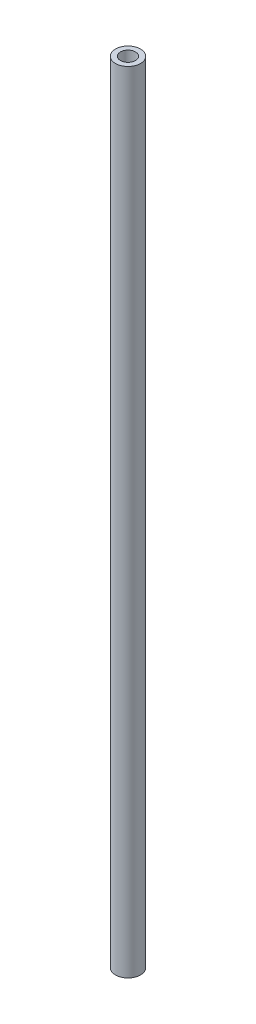
ISO-10303-21;
HEADER;
FILE_DESCRIPTION(('STEP AP214'),'2;1');
FILE_NAME('part.step','',(''),(''),'','','');
FILE_SCHEMA(('AUTOMOTIVE_DESIGN { 1 0 10303 214 1 1 1 1 }'));
ENDSEC;
DATA;
#1=APPLICATION_CONTEXT('core data for automotive mechanical design processes');
#2=APPLICATION_PROTOCOL_DEFINITION('international standard','automotive_design',2000,#1);
#3=PRODUCT_CONTEXT('',#1,'mechanical');
#4=PRODUCT('Part','Part','',(#3));
#5=PRODUCT_RELATED_PRODUCT_CATEGORY('part','',(#4));
#6=PRODUCT_DEFINITION_FORMATION('','',#4);
#7=PRODUCT_DEFINITION_CONTEXT('part definition',#1,'design');
#8=PRODUCT_DEFINITION('design','',#6,#7);
#9=PRODUCT_DEFINITION_SHAPE('','',#8);
#10=(LENGTH_UNIT() NAMED_UNIT(*) SI_UNIT(.MILLI.,.METRE.));
#11=(NAMED_UNIT(*) PLANE_ANGLE_UNIT() SI_UNIT($,.RADIAN.));
#12=(NAMED_UNIT(*) SI_UNIT($,.STERADIAN.) SOLID_ANGLE_UNIT());
#13=UNCERTAINTY_MEASURE_WITH_UNIT(LENGTH_MEASURE(1.E-05),#10,'distance_accuracy_value','');
#14=(GEOMETRIC_REPRESENTATION_CONTEXT(3) GLOBAL_UNCERTAINTY_ASSIGNED_CONTEXT((#13)) GLOBAL_UNIT_ASSIGNED_CONTEXT((#10,
#11,#12)) REPRESENTATION_CONTEXT('',''));
#15=CARTESIAN_POINT('',(0.,0.,0.));
#16=DIRECTION('',(0.,0.,1.));
#17=DIRECTION('',(1.,0.,0.));
#18=AXIS2_PLACEMENT_3D('',#15,#16,#17);
#19=CARTESIAN_POINT('',(0.,50.,0.));
#20=DIRECTION('',(0.,1.,0.));
#21=DIRECTION('',(0.,0.,1.));
#22=AXIS2_PLACEMENT_3D('',#19,#20,#21);
#23=PLANE('',#22);
#24=CARTESIAN_POINT('',(0.,50.,0.));
#25=DIRECTION('',(0.,1.,0.));
#26=DIRECTION('',(0.,0.,1.));
#27=AXIS2_PLACEMENT_3D('',#24,#25,#26);
#28=CIRCLE('',#27,1.5875);
#29=CARTESIAN_POINT('',(0.,50.,1.5875));
#30=VERTEX_POINT('',#29);
#31=EDGE_CURVE('E10',#30,#30,#28,.T.);
#32=ORIENTED_EDGE('',*,*,#31,.T.);
#33=EDGE_LOOP('',(#32));
#34=FACE_BOUND('',#33,.T.);
#35=CARTESIAN_POINT('',(0.,50.,0.));
#36=DIRECTION('',(0.,1.,0.));
#37=DIRECTION('',(0.,0.,1.));
#38=AXIS2_PLACEMENT_3D('',#35,#36,#37);
#39=CIRCLE('',#38,0.9525);
#40=CARTESIAN_POINT('',(0.,50.,0.9525));
#41=VERTEX_POINT('',#40);
#42=EDGE_CURVE('E42',#41,#41,#39,.T.);
#43=ORIENTED_EDGE('',*,*,#42,.F.);
#44=EDGE_LOOP('',(#43));
#45=FACE_BOUND('',#44,.T.);
#46=ADVANCED_FACE('F31',(#34,#45),#23,.T.);
#47=CARTESIAN_POINT('',(0.,-50.,0.));
#48=DIRECTION('',(0.,1.,0.));
#49=DIRECTION('',(0.,0.,1.));
#50=AXIS2_PLACEMENT_3D('',#47,#48,#49);
#51=PLANE('',#50);
#52=CARTESIAN_POINT('',(0.,-50.,0.));
#53=DIRECTION('',(0.,1.,0.));
#54=DIRECTION('',(0.,0.,1.));
#55=AXIS2_PLACEMENT_3D('',#52,#53,#54);
#56=CIRCLE('',#55,1.5875);
#57=CARTESIAN_POINT('',(0.,-50.,1.5875));
#58=VERTEX_POINT('',#57);
#59=EDGE_CURVE('E35',#58,#58,#56,.T.);
#60=ORIENTED_EDGE('',*,*,#59,.F.);
#61=EDGE_LOOP('',(#60));
#62=FACE_BOUND('',#61,.T.);
#63=CARTESIAN_POINT('',(0.,-50.,0.));
#64=DIRECTION('',(0.,1.,0.));
#65=DIRECTION('',(0.,0.,1.));
#66=AXIS2_PLACEMENT_3D('',#63,#64,#65);
#67=CIRCLE('',#66,0.9525);
#68=CARTESIAN_POINT('',(0.,-50.,0.9525));
#69=VERTEX_POINT('',#68);
#70=EDGE_CURVE('E44',#69,#69,#67,.T.);
#71=ORIENTED_EDGE('',*,*,#70,.T.);
#72=EDGE_LOOP('',(#71));
#73=FACE_BOUND('',#72,.T.);
#74=ADVANCED_FACE('F54',(#62,#73),#51,.F.);
#75=CARTESIAN_POINT('',(0.,50.,0.));
#76=DIRECTION('',(0.,-1.,0.));
#77=DIRECTION('',(0.,0.,-1.));
#78=AXIS2_PLACEMENT_3D('',#75,#76,#77);
#79=CYLINDRICAL_SURFACE('',#78,1.5875);
#80=ORIENTED_EDGE('',*,*,#31,.F.);
#81=EDGE_LOOP('',(#80));
#82=FACE_BOUND('',#81,.T.);
#83=ORIENTED_EDGE('',*,*,#59,.T.);
#84=EDGE_LOOP('',(#83));
#85=FACE_BOUND('',#84,.T.);
#86=ADVANCED_FACE('F33',(#82,#85),#79,.T.);
#87=CARTESIAN_POINT('',(0.,50.,0.));
#88=DIRECTION('',(0.,-1.,0.));
#89=DIRECTION('',(0.,0.,-1.));
#90=AXIS2_PLACEMENT_3D('',#87,#88,#89);
#91=CYLINDRICAL_SURFACE('',#90,0.9525);
#92=ORIENTED_EDGE('',*,*,#42,.T.);
#93=EDGE_LOOP('',(#92));
#94=FACE_BOUND('',#93,.T.);
#95=ORIENTED_EDGE('',*,*,#70,.F.);
#96=EDGE_LOOP('',(#95));
#97=FACE_BOUND('',#96,.T.);
#98=ADVANCED_FACE('F50',(#94,#97),#91,.F.);
#99=CLOSED_SHELL('',(#46,#74,#86,#98));
#100=MANIFOLD_SOLID_BREP('B2',#99);
#101=ADVANCED_BREP_SHAPE_REPRESENTATION('',(#18,#100),#14);
#102=SHAPE_DEFINITION_REPRESENTATION(#9,#101);
ENDSEC;
END-ISO-10303-21;
